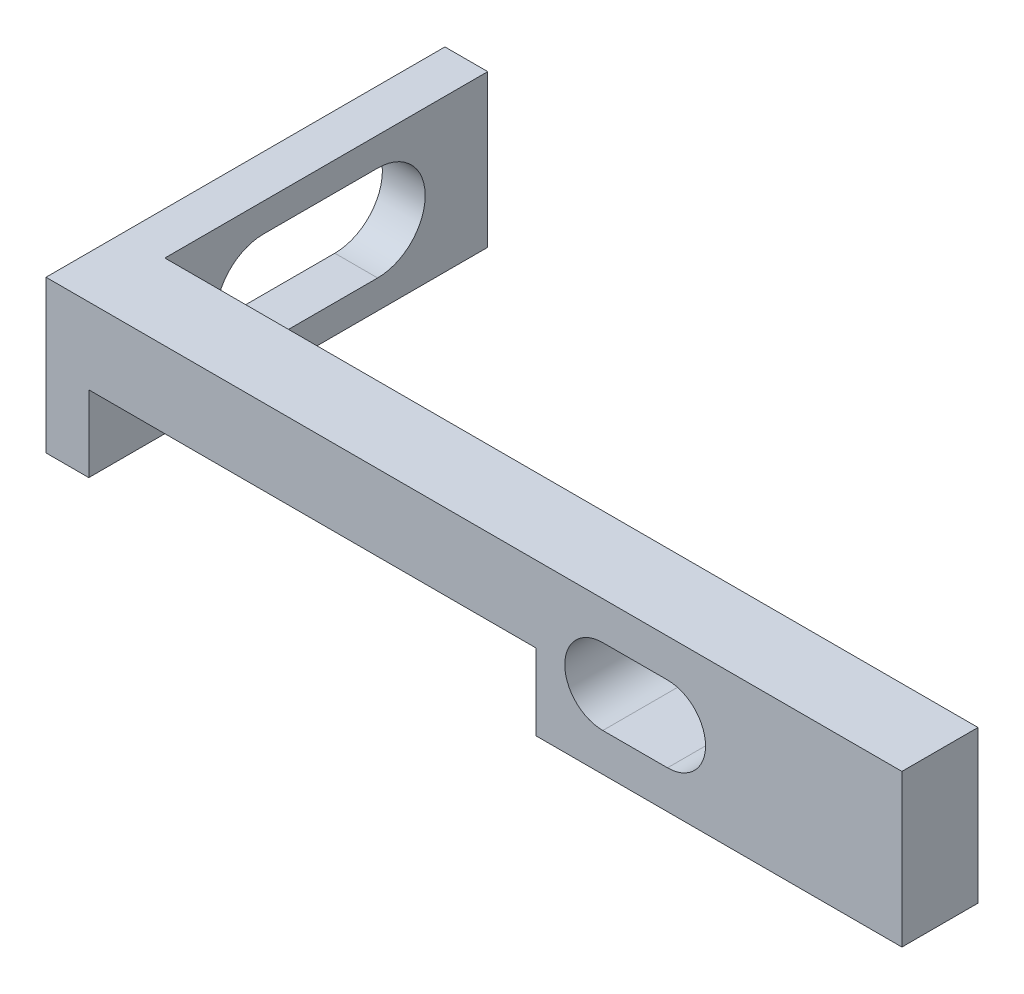
ISO-10303-21;
HEADER;
FILE_DESCRIPTION(('STEP AP214'),'2;1');
FILE_NAME('part.step','',(''),(''),'','','');
FILE_SCHEMA(('AUTOMOTIVE_DESIGN { 1 0 10303 214 1 1 1 1 }'));
ENDSEC;
DATA;
#1=APPLICATION_CONTEXT('core data for automotive mechanical design processes');
#2=APPLICATION_PROTOCOL_DEFINITION('international standard','automotive_design',2000,#1);
#3=PRODUCT_CONTEXT('',#1,'mechanical');
#4=PRODUCT('Part','Part','',(#3));
#5=PRODUCT_RELATED_PRODUCT_CATEGORY('part','',(#4));
#6=PRODUCT_DEFINITION_FORMATION('','',#4);
#7=PRODUCT_DEFINITION_CONTEXT('part definition',#1,'design');
#8=PRODUCT_DEFINITION('design','',#6,#7);
#9=PRODUCT_DEFINITION_SHAPE('','',#8);
#10=(LENGTH_UNIT() NAMED_UNIT(*) SI_UNIT(.MILLI.,.METRE.));
#11=(NAMED_UNIT(*) PLANE_ANGLE_UNIT() SI_UNIT($,.RADIAN.));
#12=(NAMED_UNIT(*) SI_UNIT($,.STERADIAN.) SOLID_ANGLE_UNIT());
#13=UNCERTAINTY_MEASURE_WITH_UNIT(LENGTH_MEASURE(1.E-05),#10,'distance_accuracy_value','');
#14=(GEOMETRIC_REPRESENTATION_CONTEXT(3) GLOBAL_UNCERTAINTY_ASSIGNED_CONTEXT((#13)) GLOBAL_UNIT_ASSIGNED_CONTEXT((#10,
#11,#12)) REPRESENTATION_CONTEXT('',''));
#15=CARTESIAN_POINT('',(0.,0.,0.));
#16=DIRECTION('',(0.,0.,1.));
#17=DIRECTION('',(1.,0.,0.));
#18=AXIS2_PLACEMENT_3D('',#15,#16,#17);
#19=CARTESIAN_POINT('',(0.,0.,0.));
#20=DIRECTION('',(0.,1.,0.));
#21=DIRECTION('',(0.,0.,1.));
#22=AXIS2_PLACEMENT_3D('',#19,#20,#21);
#23=PLANE('',#22);
#24=DIRECTION('',(0.,0.,-1.));
#25=VECTOR('',#24,1.);
#26=CARTESIAN_POINT('',(3.25000000000001,0.,12.5));
#27=LINE('',#26,#25);
#28=CARTESIAN_POINT('',(3.25,0.,12.5));
#29=VERTEX_POINT('',#28);
#30=CARTESIAN_POINT('',(3.25000000000001,0.,8.5));
#31=VERTEX_POINT('',#30);
#32=EDGE_CURVE('E203',#29,#31,#27,.T.);
#33=ORIENTED_EDGE('',*,*,#32,.F.);
#34=DIRECTION('',(1.,0.,0.));
#35=VECTOR('',#34,1.);
#36=CARTESIAN_POINT('',(-22.5,0.,12.5));
#37=LINE('',#36,#35);
#38=CARTESIAN_POINT('',(-20.25,0.,12.5));
#39=VERTEX_POINT('',#38);
#40=EDGE_CURVE('E251',#39,#29,#37,.T.);
#41=ORIENTED_EDGE('',*,*,#40,.F.);
#42=DIRECTION('',(0.,0.,-1.));
#43=VECTOR('',#42,1.);
#44=CARTESIAN_POINT('',(-20.25,0.,0.));
#45=LINE('',#44,#43);
#46=CARTESIAN_POINT('',(-20.25,0.,8.5));
#47=VERTEX_POINT('',#46);
#48=EDGE_CURVE('E230',#39,#47,#45,.T.);
#49=ORIENTED_EDGE('',*,*,#48,.T.);
#50=DIRECTION('',(1.,0.,0.));
#51=VECTOR('',#50,1.);
#52=CARTESIAN_POINT('',(-20.25,0.,8.5));
#53=LINE('',#52,#51);
#54=EDGE_CURVE('E243',#47,#31,#53,.T.);
#55=ORIENTED_EDGE('',*,*,#54,.T.);
#56=EDGE_LOOP('',(#33,#41,#49,#55));
#57=FACE_BOUND('',#56,.T.);
#58=ADVANCED_FACE('F33',(#57),#23,.F.);
#59=CARTESIAN_POINT('',(22.5,4.,-12.5));
#60=DIRECTION('',(-1.,0.,0.));
#61=DIRECTION('',(0.,0.,1.));
#62=AXIS2_PLACEMENT_3D('',#59,#60,#61);
#63=PLANE('',#62);
#64=DIRECTION('',(0.,0.,-1.));
#65=VECTOR('',#64,1.);
#66=CARTESIAN_POINT('',(22.5,-4.,-8.47465440443784));
#67=LINE('',#66,#65);
#68=CARTESIAN_POINT('',(22.5,-4.,12.5));
#69=VERTEX_POINT('',#68);
#70=CARTESIAN_POINT('',(22.5,-4.,8.49999999999999));
#71=VERTEX_POINT('',#70);
#72=EDGE_CURVE('E235',#69,#71,#67,.T.);
#73=ORIENTED_EDGE('',*,*,#72,.T.);
#74=DIRECTION('',(0.,1.,0.));
#75=VECTOR('',#74,1.);
#76=CARTESIAN_POINT('',(22.5,-4.,8.5));
#77=LINE('',#76,#75);
#78=CARTESIAN_POINT('',(22.5,4.,8.5));
#79=VERTEX_POINT('',#78);
#80=EDGE_CURVE('E194',#71,#79,#77,.T.);
#81=ORIENTED_EDGE('',*,*,#80,.T.);
#82=DIRECTION('',(0.,0.,-1.));
#83=VECTOR('',#82,1.);
#84=CARTESIAN_POINT('',(22.5,4.,-12.5));
#85=LINE('',#84,#83);
#86=CARTESIAN_POINT('',(22.5,4.,12.5));
#87=VERTEX_POINT('',#86);
#88=EDGE_CURVE('E252',#87,#79,#85,.T.);
#89=ORIENTED_EDGE('',*,*,#88,.F.);
#90=DIRECTION('',(0.,-1.,0.));
#91=VECTOR('',#90,1.);
#92=CARTESIAN_POINT('',(22.5,4.,12.5));
#93=LINE('',#92,#91);
#94=EDGE_CURVE('E259',#87,#69,#93,.T.);
#95=ORIENTED_EDGE('',*,*,#94,.T.);
#96=EDGE_LOOP('',(#73,#81,#89,#95));
#97=FACE_BOUND('',#96,.T.);
#98=ADVANCED_FACE('F35',(#97),#63,.F.);
#99=CARTESIAN_POINT('',(-22.5,4.,-12.5));
#100=DIRECTION('',(1.,0.,0.));
#101=DIRECTION('',(0.,0.,-1.));
#102=AXIS2_PLACEMENT_3D('',#99,#100,#101);
#103=PLANE('',#102);
#104=DIRECTION('',(0.,0.,-1.));
#105=VECTOR('',#104,1.);
#106=CARTESIAN_POINT('',(-22.5,2.5,3.31454912255757));
#107=LINE('',#106,#105);
#108=CARTESIAN_POINT('',(-22.5,2.5,3.31454912255757));
#109=VERTEX_POINT('',#108);
#110=CARTESIAN_POINT('',(-22.5,2.5,-2.68545087744243));
#111=VERTEX_POINT('',#110);
#112=EDGE_CURVE('E182',#109,#111,#107,.T.);
#113=ORIENTED_EDGE('',*,*,#112,.F.);
#114=CARTESIAN_POINT('',(-22.5,0.,3.31454912255757));
#115=DIRECTION('',(-1.,0.,0.));
#116=DIRECTION('',(0.,0.,1.));
#117=AXIS2_PLACEMENT_3D('',#114,#115,#116);
#118=CIRCLE('',#117,2.5);
#119=CARTESIAN_POINT('',(-22.5,-2.5,3.31454912255757));
#120=VERTEX_POINT('',#119);
#121=EDGE_CURVE('E178',#120,#109,#118,.T.);
#122=ORIENTED_EDGE('',*,*,#121,.F.);
#123=DIRECTION('',(0.,0.,1.));
#124=VECTOR('',#123,1.);
#125=CARTESIAN_POINT('',(-22.5,-2.5,3.31454912255757));
#126=LINE('',#125,#124);
#127=CARTESIAN_POINT('',(-22.5,-2.5,-2.68545087744243));
#128=VERTEX_POINT('',#127);
#129=EDGE_CURVE('E188',#128,#120,#126,.T.);
#130=ORIENTED_EDGE('',*,*,#129,.F.);
#131=CARTESIAN_POINT('',(-22.5,0.,-2.68545087744243));
#132=DIRECTION('',(-1.,0.,0.));
#133=DIRECTION('',(0.,0.,1.));
#134=AXIS2_PLACEMENT_3D('',#131,#132,#133);
#135=CIRCLE('',#134,2.5);
#136=EDGE_CURVE('E185',#111,#128,#135,.T.);
#137=ORIENTED_EDGE('',*,*,#136,.F.);
#138=EDGE_LOOP('',(#113,#122,#130,#137));
#139=FACE_BOUND('',#138,.T.);
#140=DIRECTION('',(0.,0.,1.));
#141=VECTOR('',#140,1.);
#142=CARTESIAN_POINT('',(-22.5,4.,-12.5));
#143=LINE('',#142,#141);
#144=CARTESIAN_POINT('',(-22.5,4.,-8.47465440443784));
#145=VERTEX_POINT('',#144);
#146=CARTESIAN_POINT('',(-22.5,4.,12.5));
#147=VERTEX_POINT('',#146);
#148=EDGE_CURVE('E255',#145,#147,#143,.T.);
#149=ORIENTED_EDGE('',*,*,#148,.F.);
#150=DIRECTION('',(0.,1.,0.));
#151=VECTOR('',#150,1.);
#152=CARTESIAN_POINT('',(-22.5,0.,-8.47465440443784));
#153=LINE('',#152,#151);
#154=CARTESIAN_POINT('',(-22.5,-4.,-8.47465440443784));
#155=VERTEX_POINT('',#154);
#156=EDGE_CURVE('E240',#155,#145,#153,.T.);
#157=ORIENTED_EDGE('',*,*,#156,.F.);
#158=DIRECTION('',(0.,0.,1.));
#159=VECTOR('',#158,1.);
#160=CARTESIAN_POINT('',(-22.5,-4.,12.5));
#161=LINE('',#160,#159);
#162=CARTESIAN_POINT('',(-22.5,-4.,12.5));
#163=VERTEX_POINT('',#162);
#164=EDGE_CURVE('E216',#155,#163,#161,.T.);
#165=ORIENTED_EDGE('',*,*,#164,.T.);
#166=DIRECTION('',(0.,-1.,0.));
#167=VECTOR('',#166,1.);
#168=CARTESIAN_POINT('',(-22.5,4.,12.5));
#169=LINE('',#168,#167);
#170=EDGE_CURVE('E263',#147,#163,#169,.T.);
#171=ORIENTED_EDGE('',*,*,#170,.F.);
#172=EDGE_LOOP('',(#149,#157,#165,#171));
#173=FACE_BOUND('',#172,.T.);
#174=ADVANCED_FACE('F309',(#139,#173),#103,.F.);
#175=CARTESIAN_POINT('',(-22.5,4.,12.5));
#176=DIRECTION('',(0.,0.,-1.));
#177=DIRECTION('',(-1.,0.,0.));
#178=AXIS2_PLACEMENT_3D('',#175,#176,#177);
#179=PLANE('',#178);
#180=DIRECTION('',(1.,0.,0.));
#181=VECTOR('',#180,1.);
#182=CARTESIAN_POINT('',(6.77476247067114,-2.00000000000001,12.5));
#183=LINE('',#182,#181);
#184=CARTESIAN_POINT('',(6.77476247067114,-2.,12.5));
#185=VERTEX_POINT('',#184);
#186=CARTESIAN_POINT('',(10.1747624706711,-2.00000000000001,12.5));
#187=VERTEX_POINT('',#186);
#188=EDGE_CURVE('E164',#185,#187,#183,.T.);
#189=ORIENTED_EDGE('',*,*,#188,.F.);
#190=CARTESIAN_POINT('',(6.77476247067114,0.,12.5));
#191=DIRECTION('',(0.,0.,1.));
#192=DIRECTION('',(1.,0.,0.));
#193=AXIS2_PLACEMENT_3D('',#190,#191,#192);
#194=CIRCLE('',#193,2.);
#195=CARTESIAN_POINT('',(6.77476247067114,1.99999999999999,12.5));
#196=VERTEX_POINT('',#195);
#197=EDGE_CURVE('E48',#196,#185,#194,.T.);
#198=ORIENTED_EDGE('',*,*,#197,.F.);
#199=DIRECTION('',(-1.,0.,0.));
#200=VECTOR('',#199,1.);
#201=CARTESIAN_POINT('',(6.77476247067114,1.99999999999999,12.5));
#202=LINE('',#201,#200);
#203=CARTESIAN_POINT('',(10.1747624706711,1.99999999999999,12.5));
#204=VERTEX_POINT('',#203);
#205=EDGE_CURVE('E171',#204,#196,#202,.T.);
#206=ORIENTED_EDGE('',*,*,#205,.F.);
#207=CARTESIAN_POINT('',(10.1747624706711,0.,12.5));
#208=DIRECTION('',(0.,0.,1.));
#209=DIRECTION('',(1.,0.,0.));
#210=AXIS2_PLACEMENT_3D('',#207,#208,#209);
#211=CIRCLE('',#210,2.);
#212=EDGE_CURVE('E155',#187,#204,#211,.T.);
#213=ORIENTED_EDGE('',*,*,#212,.F.);
#214=EDGE_LOOP('',(#189,#198,#206,#213));
#215=FACE_BOUND('',#214,.T.);
#216=ORIENTED_EDGE('',*,*,#40,.T.);
#217=DIRECTION('',(0.,1.,0.));
#218=VECTOR('',#217,1.);
#219=CARTESIAN_POINT('',(3.25000000000001,-4.,12.5));
#220=LINE('',#219,#218);
#221=CARTESIAN_POINT('',(3.25000000000001,-4.,12.5));
#222=VERTEX_POINT('',#221);
#223=EDGE_CURVE('E213',#222,#29,#220,.T.);
#224=ORIENTED_EDGE('',*,*,#223,.F.);
#225=DIRECTION('',(1.,0.,0.));
#226=VECTOR('',#225,1.);
#227=CARTESIAN_POINT('',(20.25,-4.,12.5));
#228=LINE('',#227,#226);
#229=EDGE_CURVE('E232',#222,#69,#228,.T.);
#230=ORIENTED_EDGE('',*,*,#229,.T.);
#231=ORIENTED_EDGE('',*,*,#94,.F.);
#232=DIRECTION('',(1.,0.,0.));
#233=VECTOR('',#232,1.);
#234=CARTESIAN_POINT('',(-22.5,4.,12.5));
#235=LINE('',#234,#233);
#236=EDGE_CURVE('E257',#147,#87,#235,.T.);
#237=ORIENTED_EDGE('',*,*,#236,.F.);
#238=ORIENTED_EDGE('',*,*,#170,.T.);
#239=DIRECTION('',(1.,0.,0.));
#240=VECTOR('',#239,1.);
#241=CARTESIAN_POINT('',(-22.5,-4.,12.5));
#242=LINE('',#241,#240);
#243=CARTESIAN_POINT('',(-20.25,-4.,12.5));
#244=VERTEX_POINT('',#243);
#245=EDGE_CURVE('E219',#163,#244,#242,.T.);
#246=ORIENTED_EDGE('',*,*,#245,.T.);
#247=DIRECTION('',(0.,1.,0.));
#248=VECTOR('',#247,1.);
#249=CARTESIAN_POINT('',(-20.25,-4.,12.5));
#250=LINE('',#249,#248);
#251=EDGE_CURVE('E228',#244,#39,#250,.T.);
#252=ORIENTED_EDGE('',*,*,#251,.T.);
#253=EDGE_LOOP('',(#216,#224,#230,#231,#237,#238,#246,#252));
#254=FACE_BOUND('',#253,.T.);
#255=ADVANCED_FACE('F168',(#215,#254),#179,.F.);
#256=CARTESIAN_POINT('',(0.,4.,0.));
#257=DIRECTION('',(0.,1.,0.));
#258=DIRECTION('',(0.,0.,1.));
#259=AXIS2_PLACEMENT_3D('',#256,#257,#258);
#260=PLANE('',#259);
#261=ORIENTED_EDGE('',*,*,#88,.T.);
#262=DIRECTION('',(1.,0.,0.));
#263=VECTOR('',#262,1.);
#264=CARTESIAN_POINT('',(-20.25,4.,8.5));
#265=LINE('',#264,#263);
#266=CARTESIAN_POINT('',(-20.25,4.,8.5));
#267=VERTEX_POINT('',#266);
#268=EDGE_CURVE('E246',#267,#79,#265,.T.);
#269=ORIENTED_EDGE('',*,*,#268,.F.);
#270=DIRECTION('',(0.,0.,1.));
#271=VECTOR('',#270,1.);
#272=CARTESIAN_POINT('',(-20.25,4.,-8.5));
#273=LINE('',#272,#271);
#274=CARTESIAN_POINT('',(-20.25,4.,-8.47465440443784));
#275=VERTEX_POINT('',#274);
#276=EDGE_CURVE('E242',#275,#267,#273,.T.);
#277=ORIENTED_EDGE('',*,*,#276,.F.);
#278=DIRECTION('',(1.,0.,0.));
#279=VECTOR('',#278,1.);
#280=CARTESIAN_POINT('',(-22.5,4.,-8.47465440443784));
#281=LINE('',#280,#279);
#282=EDGE_CURVE('E238',#145,#275,#281,.T.);
#283=ORIENTED_EDGE('',*,*,#282,.F.);
#284=ORIENTED_EDGE('',*,*,#148,.T.);
#285=ORIENTED_EDGE('',*,*,#236,.T.);
#286=EDGE_LOOP('',(#261,#269,#277,#283,#284,#285));
#287=FACE_BOUND('',#286,.T.);
#288=ADVANCED_FACE('F313',(#287),#260,.T.);
#289=CARTESIAN_POINT('',(-20.25,0.,8.5));
#290=DIRECTION('',(0.,0.,1.));
#291=DIRECTION('',(1.,0.,0.));
#292=AXIS2_PLACEMENT_3D('',#289,#290,#291);
#293=PLANE('',#292);
#294=DIRECTION('',(-1.,0.,0.));
#295=VECTOR('',#294,1.);
#296=CARTESIAN_POINT('',(-20.25,1.99999999999999,8.5));
#297=LINE('',#296,#295);
#298=CARTESIAN_POINT('',(10.1747624706711,1.99999999999999,8.49999999999999));
#299=VERTEX_POINT('',#298);
#300=CARTESIAN_POINT('',(6.77476247067114,1.99999999999999,8.49999999999999));
#301=VERTEX_POINT('',#300);
#302=EDGE_CURVE('E41',#299,#301,#297,.T.);
#303=ORIENTED_EDGE('',*,*,#302,.T.);
#304=CARTESIAN_POINT('',(6.77476247067114,0.,8.5));
#305=DIRECTION('',(0.,0.,1.));
#306=DIRECTION('',(1.,0.,0.));
#307=AXIS2_PLACEMENT_3D('',#304,#305,#306);
#308=CIRCLE('',#307,2.);
#309=CARTESIAN_POINT('',(6.77476247067114,-2.00000000000001,8.49999999999999));
#310=VERTEX_POINT('',#309);
#311=EDGE_CURVE('E11',#301,#310,#308,.T.);
#312=ORIENTED_EDGE('',*,*,#311,.T.);
#313=DIRECTION('',(1.,0.,0.));
#314=VECTOR('',#313,1.);
#315=CARTESIAN_POINT('',(-20.25,-2.00000000000001,8.5));
#316=LINE('',#315,#314);
#317=CARTESIAN_POINT('',(10.1747624706711,-2.00000000000001,8.5));
#318=VERTEX_POINT('',#317);
#319=EDGE_CURVE('E280',#310,#318,#316,.T.);
#320=ORIENTED_EDGE('',*,*,#319,.T.);
#321=CARTESIAN_POINT('',(10.1747624706711,0.,8.5));
#322=DIRECTION('',(0.,0.,1.));
#323=DIRECTION('',(1.,0.,0.));
#324=AXIS2_PLACEMENT_3D('',#321,#322,#323);
#325=CIRCLE('',#324,2.);
#326=EDGE_CURVE('E158',#318,#299,#325,.T.);
#327=ORIENTED_EDGE('',*,*,#326,.T.);
#328=EDGE_LOOP('',(#303,#312,#320,#327));
#329=FACE_BOUND('',#328,.T.);
#330=ORIENTED_EDGE('',*,*,#268,.T.);
#331=ORIENTED_EDGE('',*,*,#80,.F.);
#332=DIRECTION('',(1.,0.,0.));
#333=VECTOR('',#332,1.);
#334=CARTESIAN_POINT('',(20.25,-4.,8.5));
#335=LINE('',#334,#333);
#336=CARTESIAN_POINT('',(3.25000000000001,-4.,8.5));
#337=VERTEX_POINT('',#336);
#338=EDGE_CURVE('E206',#337,#71,#335,.T.);
#339=ORIENTED_EDGE('',*,*,#338,.F.);
#340=DIRECTION('',(0.,1.,0.));
#341=VECTOR('',#340,1.);
#342=CARTESIAN_POINT('',(3.25000000000001,-4.,8.5));
#343=LINE('',#342,#341);
#344=EDGE_CURVE('E208',#337,#31,#343,.T.);
#345=ORIENTED_EDGE('',*,*,#344,.T.);
#346=ORIENTED_EDGE('',*,*,#54,.F.);
#347=DIRECTION('',(0.,1.,0.));
#348=VECTOR('',#347,1.);
#349=CARTESIAN_POINT('',(-20.25,0.,8.5));
#350=LINE('',#349,#348);
#351=EDGE_CURVE('E245',#47,#267,#350,.T.);
#352=ORIENTED_EDGE('',*,*,#351,.T.);
#353=EDGE_LOOP('',(#330,#331,#339,#345,#346,#352));
#354=FACE_BOUND('',#353,.T.);
#355=ADVANCED_FACE('F284',(#329,#354),#293,.F.);
#356=CARTESIAN_POINT('',(-20.25,0.,-8.5));
#357=DIRECTION('',(-1.,0.,0.));
#358=DIRECTION('',(0.,0.,1.));
#359=AXIS2_PLACEMENT_3D('',#356,#357,#358);
#360=PLANE('',#359);
#361=DIRECTION('',(0.,0.,1.));
#362=VECTOR('',#361,1.);
#363=CARTESIAN_POINT('',(-20.25,-2.5,-8.5));
#364=LINE('',#363,#362);
#365=CARTESIAN_POINT('',(-20.25,-2.5,-2.68545087744243));
#366=VERTEX_POINT('',#365);
#367=CARTESIAN_POINT('',(-20.25,-2.5,3.31454912255757));
#368=VERTEX_POINT('',#367);
#369=EDGE_CURVE('E274',#366,#368,#364,.T.);
#370=ORIENTED_EDGE('',*,*,#369,.T.);
#371=CARTESIAN_POINT('',(-20.25,0.,3.31454912255757));
#372=DIRECTION('',(-1.,0.,0.));
#373=DIRECTION('',(0.,0.,1.));
#374=AXIS2_PLACEMENT_3D('',#371,#372,#373);
#375=CIRCLE('',#374,2.5);
#376=CARTESIAN_POINT('',(-20.25,2.5,3.31454912255757));
#377=VERTEX_POINT('',#376);
#378=EDGE_CURVE('E277',#368,#377,#375,.T.);
#379=ORIENTED_EDGE('',*,*,#378,.T.);
#380=DIRECTION('',(0.,0.,-1.));
#381=VECTOR('',#380,1.);
#382=CARTESIAN_POINT('',(-20.25,2.5,-8.5));
#383=LINE('',#382,#381);
#384=CARTESIAN_POINT('',(-20.25,2.5,-2.68545087744243));
#385=VERTEX_POINT('',#384);
#386=EDGE_CURVE('E268',#377,#385,#383,.T.);
#387=ORIENTED_EDGE('',*,*,#386,.T.);
#388=CARTESIAN_POINT('',(-20.25,0.,-2.68545087744243));
#389=DIRECTION('',(-1.,0.,0.));
#390=DIRECTION('',(0.,0.,1.));
#391=AXIS2_PLACEMENT_3D('',#388,#389,#390);
#392=CIRCLE('',#391,2.5);
#393=EDGE_CURVE('E271',#385,#366,#392,.T.);
#394=ORIENTED_EDGE('',*,*,#393,.T.);
#395=EDGE_LOOP('',(#370,#379,#387,#394));
#396=FACE_BOUND('',#395,.T.);
#397=ORIENTED_EDGE('',*,*,#351,.F.);
#398=ORIENTED_EDGE('',*,*,#48,.F.);
#399=ORIENTED_EDGE('',*,*,#251,.F.);
#400=DIRECTION('',(0.,0.,-1.));
#401=VECTOR('',#400,1.);
#402=CARTESIAN_POINT('',(-20.25,-4.,12.5));
#403=LINE('',#402,#401);
#404=CARTESIAN_POINT('',(-20.25,-4.,-8.47465440443784));
#405=VERTEX_POINT('',#404);
#406=EDGE_CURVE('E222',#244,#405,#403,.T.);
#407=ORIENTED_EDGE('',*,*,#406,.T.);
#408=DIRECTION('',(0.,1.,0.));
#409=VECTOR('',#408,1.);
#410=CARTESIAN_POINT('',(-20.25,0.,-8.47465440443784));
#411=LINE('',#410,#409);
#412=EDGE_CURVE('E265',#405,#275,#411,.T.);
#413=ORIENTED_EDGE('',*,*,#412,.T.);
#414=ORIENTED_EDGE('',*,*,#276,.T.);
#415=EDGE_LOOP('',(#397,#398,#399,#407,#413,#414));
#416=FACE_BOUND('',#415,.T.);
#417=ADVANCED_FACE('F337',(#396,#416),#360,.F.);
#418=CARTESIAN_POINT('',(-22.5,0.,-8.47465440443784));
#419=DIRECTION('',(0.,0.,1.));
#420=DIRECTION('',(1.,0.,0.));
#421=AXIS2_PLACEMENT_3D('',#418,#419,#420);
#422=PLANE('',#421);
#423=ORIENTED_EDGE('',*,*,#412,.F.);
#424=DIRECTION('',(-1.,0.,0.));
#425=VECTOR('',#424,1.);
#426=CARTESIAN_POINT('',(-22.5,-4.,-8.47465440443784));
#427=LINE('',#426,#425);
#428=EDGE_CURVE('E225',#405,#155,#427,.T.);
#429=ORIENTED_EDGE('',*,*,#428,.T.);
#430=ORIENTED_EDGE('',*,*,#156,.T.);
#431=ORIENTED_EDGE('',*,*,#282,.T.);
#432=EDGE_LOOP('',(#423,#429,#430,#431));
#433=FACE_BOUND('',#432,.T.);
#434=ADVANCED_FACE('F334',(#433),#422,.F.);
#435=CARTESIAN_POINT('',(0.,-4.,0.));
#436=DIRECTION('',(0.,1.,0.));
#437=DIRECTION('',(0.,0.,1.));
#438=AXIS2_PLACEMENT_3D('',#435,#436,#437);
#439=PLANE('',#438);
#440=ORIENTED_EDGE('',*,*,#338,.T.);
#441=ORIENTED_EDGE('',*,*,#72,.F.);
#442=ORIENTED_EDGE('',*,*,#229,.F.);
#443=DIRECTION('',(0.,0.,-1.));
#444=VECTOR('',#443,1.);
#445=CARTESIAN_POINT('',(3.25000000000001,-4.,12.5));
#446=LINE('',#445,#444);
#447=EDGE_CURVE('E204',#222,#337,#446,.T.);
#448=ORIENTED_EDGE('',*,*,#447,.T.);
#449=EDGE_LOOP('',(#440,#441,#442,#448));
#450=FACE_BOUND('',#449,.T.);
#451=ADVANCED_FACE('F356',(#450),#439,.F.);
#452=CARTESIAN_POINT('',(0.,-4.,0.));
#453=DIRECTION('',(0.,-1.,0.));
#454=DIRECTION('',(0.,0.,-1.));
#455=AXIS2_PLACEMENT_3D('',#452,#453,#454);
#456=PLANE('',#455);
#457=ORIENTED_EDGE('',*,*,#164,.F.);
#458=ORIENTED_EDGE('',*,*,#428,.F.);
#459=ORIENTED_EDGE('',*,*,#406,.F.);
#460=ORIENTED_EDGE('',*,*,#245,.F.);
#461=EDGE_LOOP('',(#457,#458,#459,#460));
#462=FACE_BOUND('',#461,.T.);
#463=ADVANCED_FACE('F343',(#462),#456,.T.);
#464=CARTESIAN_POINT('',(3.25000000000001,-4.,12.5));
#465=DIRECTION('',(1.,0.,0.));
#466=DIRECTION('',(0.,0.,-1.));
#467=AXIS2_PLACEMENT_3D('',#464,#465,#466);
#468=PLANE('',#467);
#469=ORIENTED_EDGE('',*,*,#32,.T.);
#470=ORIENTED_EDGE('',*,*,#344,.F.);
#471=ORIENTED_EDGE('',*,*,#447,.F.);
#472=ORIENTED_EDGE('',*,*,#223,.T.);
#473=EDGE_LOOP('',(#469,#470,#471,#472));
#474=FACE_BOUND('',#473,.T.);
#475=ADVANCED_FACE('F353',(#474),#468,.F.);
#476=CARTESIAN_POINT('',(22.5,0.,3.31454912255757));
#477=DIRECTION('',(-1.,0.,0.));
#478=DIRECTION('',(0.,0.,1.));
#479=AXIS2_PLACEMENT_3D('',#476,#477,#478);
#480=CYLINDRICAL_SURFACE('',#479,2.5);
#481=DIRECTION('',(-1.,0.,0.));
#482=VECTOR('',#481,1.);
#483=CARTESIAN_POINT('',(22.5,-2.5,3.31454912255757));
#484=LINE('',#483,#482);
#485=EDGE_CURVE('E192',#368,#120,#484,.T.);
#486=ORIENTED_EDGE('',*,*,#485,.T.);
#487=ORIENTED_EDGE('',*,*,#121,.T.);
#488=DIRECTION('',(-1.,0.,0.));
#489=VECTOR('',#488,1.);
#490=CARTESIAN_POINT('',(22.5,2.5,3.31454912255757));
#491=LINE('',#490,#489);
#492=EDGE_CURVE('E191',#377,#109,#491,.T.);
#493=ORIENTED_EDGE('',*,*,#492,.F.);
#494=ORIENTED_EDGE('',*,*,#378,.F.);
#495=EDGE_LOOP('',(#486,#487,#493,#494));
#496=FACE_BOUND('',#495,.T.);
#497=ADVANCED_FACE('F381',(#496),#480,.F.);
#498=CARTESIAN_POINT('',(22.5,-2.5,3.31454912255757));
#499=DIRECTION('',(0.,-1.,0.));
#500=DIRECTION('',(0.,0.,-1.));
#501=AXIS2_PLACEMENT_3D('',#498,#499,#500);
#502=PLANE('',#501);
#503=DIRECTION('',(-1.,0.,0.));
#504=VECTOR('',#503,1.);
#505=CARTESIAN_POINT('',(22.5,-2.5,-2.68545087744243));
#506=LINE('',#505,#504);
#507=EDGE_CURVE('E195',#366,#128,#506,.T.);
#508=ORIENTED_EDGE('',*,*,#507,.T.);
#509=ORIENTED_EDGE('',*,*,#129,.T.);
#510=ORIENTED_EDGE('',*,*,#485,.F.);
#511=ORIENTED_EDGE('',*,*,#369,.F.);
#512=EDGE_LOOP('',(#508,#509,#510,#511));
#513=FACE_BOUND('',#512,.T.);
#514=ADVANCED_FACE('F376',(#513),#502,.F.);
#515=CARTESIAN_POINT('',(22.5,0.,-2.68545087744243));
#516=DIRECTION('',(-1.,0.,0.));
#517=DIRECTION('',(0.,0.,1.));
#518=AXIS2_PLACEMENT_3D('',#515,#516,#517);
#519=CYLINDRICAL_SURFACE('',#518,2.5);
#520=DIRECTION('',(-1.,0.,0.));
#521=VECTOR('',#520,1.);
#522=CARTESIAN_POINT('',(22.5,2.5,-2.68545087744243));
#523=LINE('',#522,#521);
#524=EDGE_CURVE('E197',#385,#111,#523,.T.);
#525=ORIENTED_EDGE('',*,*,#524,.T.);
#526=ORIENTED_EDGE('',*,*,#136,.T.);
#527=ORIENTED_EDGE('',*,*,#507,.F.);
#528=ORIENTED_EDGE('',*,*,#393,.F.);
#529=EDGE_LOOP('',(#525,#526,#527,#528));
#530=FACE_BOUND('',#529,.T.);
#531=ADVANCED_FACE('F298',(#530),#519,.F.);
#532=CARTESIAN_POINT('',(22.5,2.5,3.31454912255757));
#533=DIRECTION('',(0.,1.,0.));
#534=DIRECTION('',(0.,0.,1.));
#535=AXIS2_PLACEMENT_3D('',#532,#533,#534);
#536=PLANE('',#535);
#537=ORIENTED_EDGE('',*,*,#492,.T.);
#538=ORIENTED_EDGE('',*,*,#112,.T.);
#539=ORIENTED_EDGE('',*,*,#524,.F.);
#540=ORIENTED_EDGE('',*,*,#386,.F.);
#541=EDGE_LOOP('',(#537,#538,#539,#540));
#542=FACE_BOUND('',#541,.T.);
#543=ADVANCED_FACE('F291',(#542),#536,.F.);
#544=CARTESIAN_POINT('',(6.77476247067114,0.,-8.47465440443784));
#545=DIRECTION('',(0.,0.,1.));
#546=DIRECTION('',(1.,0.,0.));
#547=AXIS2_PLACEMENT_3D('',#544,#545,#546);
#548=CYLINDRICAL_SURFACE('',#547,2.);
#549=DIRECTION('',(0.,0.,1.));
#550=VECTOR('',#549,1.);
#551=CARTESIAN_POINT('',(6.77476247067114,1.99999999999999,-8.47465440443784));
#552=LINE('',#551,#550);
#553=EDGE_CURVE('E176',#301,#196,#552,.T.);
#554=ORIENTED_EDGE('',*,*,#553,.T.);
#555=ORIENTED_EDGE('',*,*,#197,.T.);
#556=DIRECTION('',(0.,0.,1.));
#557=VECTOR('',#556,1.);
#558=CARTESIAN_POINT('',(6.77476247067114,-2.00000000000001,-8.47465440443784));
#559=LINE('',#558,#557);
#560=EDGE_CURVE('E161',#310,#185,#559,.T.);
#561=ORIENTED_EDGE('',*,*,#560,.F.);
#562=ORIENTED_EDGE('',*,*,#311,.F.);
#563=EDGE_LOOP('',(#554,#555,#561,#562));
#564=FACE_BOUND('',#563,.T.);
#565=ADVANCED_FACE('F289',(#564),#548,.F.);
#566=CARTESIAN_POINT('',(6.77476247067114,1.99999999999999,-8.47465440443784));
#567=DIRECTION('',(0.,1.,0.));
#568=DIRECTION('',(-1.,0.,0.));
#569=AXIS2_PLACEMENT_3D('',#566,#567,#568);
#570=PLANE('',#569);
#571=DIRECTION('',(0.,0.,1.));
#572=VECTOR('',#571,1.);
#573=CARTESIAN_POINT('',(10.1747624706711,1.99999999999999,-8.47465440443784));
#574=LINE('',#573,#572);
#575=EDGE_CURVE('E160',#299,#204,#574,.T.);
#576=ORIENTED_EDGE('',*,*,#575,.T.);
#577=ORIENTED_EDGE('',*,*,#205,.T.);
#578=ORIENTED_EDGE('',*,*,#553,.F.);
#579=ORIENTED_EDGE('',*,*,#302,.F.);
#580=EDGE_LOOP('',(#576,#577,#578,#579));
#581=FACE_BOUND('',#580,.T.);
#582=ADVANCED_FACE('F288',(#581),#570,.F.);
#583=CARTESIAN_POINT('',(10.1747624706711,0.,-8.47465440443784));
#584=DIRECTION('',(0.,0.,1.));
#585=DIRECTION('',(1.,0.,0.));
#586=AXIS2_PLACEMENT_3D('',#583,#584,#585);
#587=CYLINDRICAL_SURFACE('',#586,2.);
#588=DIRECTION('',(0.,0.,1.));
#589=VECTOR('',#588,1.);
#590=CARTESIAN_POINT('',(10.1747624706711,-2.00000000000001,-8.47465440443784));
#591=LINE('',#590,#589);
#592=EDGE_CURVE('E56',#318,#187,#591,.T.);
#593=ORIENTED_EDGE('',*,*,#592,.T.);
#594=ORIENTED_EDGE('',*,*,#212,.T.);
#595=ORIENTED_EDGE('',*,*,#575,.F.);
#596=ORIENTED_EDGE('',*,*,#326,.F.);
#597=EDGE_LOOP('',(#593,#594,#595,#596));
#598=FACE_BOUND('',#597,.T.);
#599=ADVANCED_FACE('F152',(#598),#587,.F.);
#600=CARTESIAN_POINT('',(6.77476247067114,-2.00000000000001,-8.47465440443784));
#601=DIRECTION('',(0.,-1.,0.));
#602=DIRECTION('',(1.,0.,0.));
#603=AXIS2_PLACEMENT_3D('',#600,#601,#602);
#604=PLANE('',#603);
#605=ORIENTED_EDGE('',*,*,#560,.T.);
#606=ORIENTED_EDGE('',*,*,#188,.T.);
#607=ORIENTED_EDGE('',*,*,#592,.F.);
#608=ORIENTED_EDGE('',*,*,#319,.F.);
#609=EDGE_LOOP('',(#605,#606,#607,#608));
#610=FACE_BOUND('',#609,.T.);
#611=ADVANCED_FACE('F165',(#610),#604,.F.);
#612=CLOSED_SHELL('',(#58,#98,#174,#255,#288,#355,#417,#434,#451,#463,#475,#497,#514,#531,#543,
#565,#582,#599,#611));
#613=MANIFOLD_SOLID_BREP('B2',#612);
#614=ADVANCED_BREP_SHAPE_REPRESENTATION('',(#18,#613),#14);
#615=SHAPE_DEFINITION_REPRESENTATION(#9,#614);
ENDSEC;
END-ISO-10303-21;
